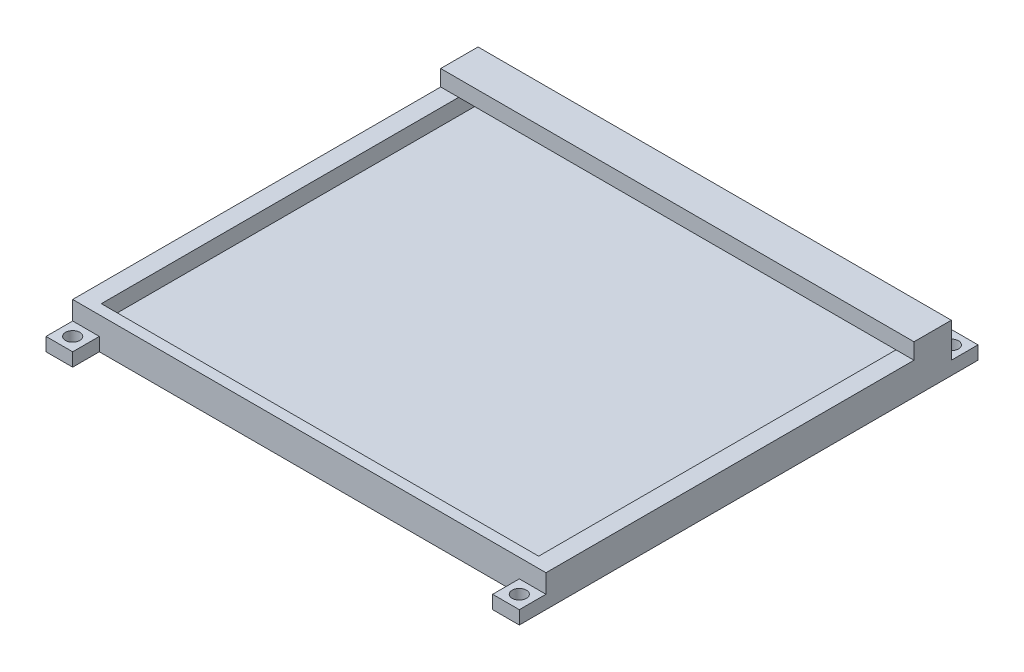
ISO-10303-21;
HEADER;
FILE_DESCRIPTION(('STEP AP214'),'2;1');
FILE_NAME('part.step','',(''),(''),'','','');
FILE_SCHEMA(('AUTOMOTIVE_DESIGN { 1 0 10303 214 1 1 1 1 }'));
ENDSEC;
DATA;
#1=APPLICATION_CONTEXT('core data for automotive mechanical design processes');
#2=APPLICATION_PROTOCOL_DEFINITION('international standard','automotive_design',2000,#1);
#3=PRODUCT_CONTEXT('',#1,'mechanical');
#4=PRODUCT('Part','Part','',(#3));
#5=PRODUCT_RELATED_PRODUCT_CATEGORY('part','',(#4));
#6=PRODUCT_DEFINITION_FORMATION('','',#4);
#7=PRODUCT_DEFINITION_CONTEXT('part definition',#1,'design');
#8=PRODUCT_DEFINITION('design','',#6,#7);
#9=PRODUCT_DEFINITION_SHAPE('','',#8);
#10=(LENGTH_UNIT() NAMED_UNIT(*) SI_UNIT(.MILLI.,.METRE.));
#11=(NAMED_UNIT(*) PLANE_ANGLE_UNIT() SI_UNIT($,.RADIAN.));
#12=(NAMED_UNIT(*) SI_UNIT($,.STERADIAN.) SOLID_ANGLE_UNIT());
#13=UNCERTAINTY_MEASURE_WITH_UNIT(LENGTH_MEASURE(1.E-05),#10,'distance_accuracy_value','');
#14=(GEOMETRIC_REPRESENTATION_CONTEXT(3) GLOBAL_UNCERTAINTY_ASSIGNED_CONTEXT((#13)) GLOBAL_UNIT_ASSIGNED_CONTEXT((#10,
#11,#12)) REPRESENTATION_CONTEXT('',''));
#15=CARTESIAN_POINT('',(0.,0.,0.));
#16=DIRECTION('',(0.,0.,1.));
#17=DIRECTION('',(1.,0.,0.));
#18=AXIS2_PLACEMENT_3D('',#15,#16,#17);
#19=CARTESIAN_POINT('',(0.,7.62,0.));
#20=DIRECTION('',(0.,-1.,0.));
#21=DIRECTION('',(0.,0.,-1.));
#22=AXIS2_PLACEMENT_3D('',#19,#20,#21);
#23=PLANE('',#22);
#24=DIRECTION('',(1.,0.,0.));
#25=VECTOR('',#24,1.);
#26=CARTESIAN_POINT('',(0.,7.62,-87.63));
#27=LINE('',#26,#25);
#28=CARTESIAN_POINT('',(0.,7.62,-87.63));
#29=VERTEX_POINT('',#28);
#30=CARTESIAN_POINT('',(4.279999949,7.62,-87.63));
#31=VERTEX_POINT('',#30);
#32=EDGE_CURVE('E49',#29,#31,#27,.T.);
#33=ORIENTED_EDGE('',*,*,#32,.F.);
#34=DIRECTION('',(0.,0.,1.));
#35=VECTOR('',#34,1.);
#36=CARTESIAN_POINT('',(0.,7.62,0.));
#37=LINE('',#36,#35);
#38=CARTESIAN_POINT('',(0.,7.62,0.));
#39=VERTEX_POINT('',#38);
#40=EDGE_CURVE('E216',#29,#39,#37,.T.);
#41=ORIENTED_EDGE('',*,*,#40,.T.);
#42=DIRECTION('',(1.,0.,0.));
#43=VECTOR('',#42,1.);
#44=CARTESIAN_POINT('',(0.,7.62,0.));
#45=LINE('',#44,#43);
#46=CARTESIAN_POINT('',(112.699999898,7.62,0.));
#47=VERTEX_POINT('',#46);
#48=EDGE_CURVE('E381',#39,#47,#45,.T.);
#49=ORIENTED_EDGE('',*,*,#48,.T.);
#50=DIRECTION('',(0.,0.,-1.));
#51=VECTOR('',#50,1.);
#52=CARTESIAN_POINT('',(112.699999898,7.62,0.));
#53=LINE('',#52,#51);
#54=CARTESIAN_POINT('',(112.699999898,7.62,-87.63));
#55=VERTEX_POINT('',#54);
#56=EDGE_CURVE('E384',#47,#55,#53,.T.);
#57=ORIENTED_EDGE('',*,*,#56,.T.);
#58=CARTESIAN_POINT('',(108.419999949,7.62,-87.63));
#59=VERTEX_POINT('',#58);
#60=EDGE_CURVE('E11',#59,#55,#27,.T.);
#61=ORIENTED_EDGE('',*,*,#60,.F.);
#62=DIRECTION('',(0.,0.,-1.));
#63=VECTOR('',#62,1.);
#64=CARTESIAN_POINT('',(108.419999949,7.62,-2.54000000000001));
#65=LINE('',#64,#63);
#66=CARTESIAN_POINT('',(108.419999949,7.62,-2.54000000000001));
#67=VERTEX_POINT('',#66);
#68=EDGE_CURVE('E366',#67,#59,#65,.T.);
#69=ORIENTED_EDGE('',*,*,#68,.F.);
#70=DIRECTION('',(1.,0.,0.));
#71=VECTOR('',#70,1.);
#72=CARTESIAN_POINT('',(4.279999949,7.62,-2.54000000000001));
#73=LINE('',#72,#71);
#74=CARTESIAN_POINT('',(4.279999949,7.62,-2.54000000000001));
#75=VERTEX_POINT('',#74);
#76=EDGE_CURVE('E362',#75,#67,#73,.T.);
#77=ORIENTED_EDGE('',*,*,#76,.F.);
#78=DIRECTION('',(0.,0.,1.));
#79=VECTOR('',#78,1.);
#80=CARTESIAN_POINT('',(4.279999949,7.62,-2.54000000000001));
#81=LINE('',#80,#79);
#82=EDGE_CURVE('E340',#31,#75,#81,.T.);
#83=ORIENTED_EDGE('',*,*,#82,.F.);
#84=EDGE_LOOP('',(#33,#41,#49,#57,#61,#69,#77,#83));
#85=FACE_BOUND('',#84,.T.);
#86=ADVANCED_FACE('F39',(#85),#23,.F.);
#87=CARTESIAN_POINT('',(0.,7.62,-96.52));
#88=DIRECTION('',(0.,0.,1.));
#89=DIRECTION('',(1.,0.,0.));
#90=AXIS2_PLACEMENT_3D('',#87,#88,#89);
#91=PLANE('',#90);
#92=DIRECTION('',(-1.,0.,0.));
#93=VECTOR('',#92,1.);
#94=CARTESIAN_POINT('',(112.699999898,3.175,-96.52));
#95=LINE('',#94,#93);
#96=CARTESIAN_POINT('',(112.699999898,3.175,-96.52));
#97=VERTEX_POINT('',#96);
#98=CARTESIAN_POINT('',(106.349999898,3.175,-96.52));
#99=VERTEX_POINT('',#98);
#100=EDGE_CURVE('E242',#97,#99,#95,.T.);
#101=ORIENTED_EDGE('',*,*,#100,.T.);
#102=DIRECTION('',(0.,-1.,0.));
#103=VECTOR('',#102,1.);
#104=CARTESIAN_POINT('',(106.349999898,3.175,-96.52));
#105=LINE('',#104,#103);
#106=CARTESIAN_POINT('',(106.349999898,0.,-96.52));
#107=VERTEX_POINT('',#106);
#108=EDGE_CURVE('E224',#99,#107,#105,.T.);
#109=ORIENTED_EDGE('',*,*,#108,.T.);
#110=DIRECTION('',(-1.,0.,0.));
#111=VECTOR('',#110,1.);
#112=CARTESIAN_POINT('',(0.,0.,-96.52));
#113=LINE('',#112,#111);
#114=CARTESIAN_POINT('',(6.35,0.,-96.52));
#115=VERTEX_POINT('',#114);
#116=EDGE_CURVE('E382',#107,#115,#113,.T.);
#117=ORIENTED_EDGE('',*,*,#116,.T.);
#118=DIRECTION('',(0.,-1.,0.));
#119=VECTOR('',#118,1.);
#120=CARTESIAN_POINT('',(6.35,3.175,-96.52));
#121=LINE('',#120,#119);
#122=CARTESIAN_POINT('',(6.35,3.175,-96.52));
#123=VERTEX_POINT('',#122);
#124=EDGE_CURVE('E249',#123,#115,#121,.T.);
#125=ORIENTED_EDGE('',*,*,#124,.F.);
#126=DIRECTION('',(-1.,0.,0.));
#127=VECTOR('',#126,1.);
#128=CARTESIAN_POINT('',(0.,3.175,-96.52));
#129=LINE('',#128,#127);
#130=CARTESIAN_POINT('',(0.,3.175,-96.52));
#131=VERTEX_POINT('',#130);
#132=EDGE_CURVE('E255',#123,#131,#129,.T.);
#133=ORIENTED_EDGE('',*,*,#132,.T.);
#134=DIRECTION('',(0.,-1.,0.));
#135=VECTOR('',#134,1.);
#136=CARTESIAN_POINT('',(0.,7.62,-96.52));
#137=LINE('',#136,#135);
#138=CARTESIAN_POINT('',(0.,11.43,-96.52));
#139=VERTEX_POINT('',#138);
#140=EDGE_CURVE('E386',#139,#131,#137,.T.);
#141=ORIENTED_EDGE('',*,*,#140,.F.);
#142=DIRECTION('',(-1.,0.,0.));
#143=VECTOR('',#142,1.);
#144=CARTESIAN_POINT('',(0.,11.43,-96.52));
#145=LINE('',#144,#143);
#146=CARTESIAN_POINT('',(112.699999898,11.43,-96.52));
#147=VERTEX_POINT('',#146);
#148=EDGE_CURVE('E211',#147,#139,#145,.T.);
#149=ORIENTED_EDGE('',*,*,#148,.F.);
#150=DIRECTION('',(0.,-1.,0.));
#151=VECTOR('',#150,1.);
#152=CARTESIAN_POINT('',(112.699999898,7.62,-96.52));
#153=LINE('',#152,#151);
#154=EDGE_CURVE('E394',#147,#97,#153,.T.);
#155=ORIENTED_EDGE('',*,*,#154,.T.);
#156=EDGE_LOOP('',(#101,#109,#117,#125,#133,#141,#149,#155));
#157=FACE_BOUND('',#156,.T.);
#158=ADVANCED_FACE('F440',(#157),#91,.F.);
#159=CARTESIAN_POINT('',(0.,7.62,0.));
#160=DIRECTION('',(0.,0.,-1.));
#161=DIRECTION('',(-1.,0.,0.));
#162=AXIS2_PLACEMENT_3D('',#159,#160,#161);
#163=PLANE('',#162);
#164=DIRECTION('',(1.,0.,0.));
#165=VECTOR('',#164,1.);
#166=CARTESIAN_POINT('',(0.,3.175,0.));
#167=LINE('',#166,#165);
#168=CARTESIAN_POINT('',(0.,3.175,0.));
#169=VERTEX_POINT('',#168);
#170=CARTESIAN_POINT('',(6.35,3.175,0.));
#171=VERTEX_POINT('',#170);
#172=EDGE_CURVE('E304',#169,#171,#167,.T.);
#173=ORIENTED_EDGE('',*,*,#172,.T.);
#174=DIRECTION('',(0.,-1.,0.));
#175=VECTOR('',#174,1.);
#176=CARTESIAN_POINT('',(6.35,3.175,0.));
#177=LINE('',#176,#175);
#178=CARTESIAN_POINT('',(6.35,0.,0.));
#179=VERTEX_POINT('',#178);
#180=EDGE_CURVE('E283',#171,#179,#177,.T.);
#181=ORIENTED_EDGE('',*,*,#180,.T.);
#182=DIRECTION('',(1.,0.,0.));
#183=VECTOR('',#182,1.);
#184=CARTESIAN_POINT('',(0.,0.,0.));
#185=LINE('',#184,#183);
#186=CARTESIAN_POINT('',(106.349999898,0.,0.));
#187=VERTEX_POINT('',#186);
#188=EDGE_CURVE('E388',#179,#187,#185,.T.);
#189=ORIENTED_EDGE('',*,*,#188,.T.);
#190=DIRECTION('',(0.,-1.,0.));
#191=VECTOR('',#190,1.);
#192=CARTESIAN_POINT('',(106.349999898,3.175,0.));
#193=LINE('',#192,#191);
#194=CARTESIAN_POINT('',(106.349999898,3.175,0.));
#195=VERTEX_POINT('',#194);
#196=EDGE_CURVE('E337',#195,#187,#193,.T.);
#197=ORIENTED_EDGE('',*,*,#196,.F.);
#198=DIRECTION('',(1.,0.,0.));
#199=VECTOR('',#198,1.);
#200=CARTESIAN_POINT('',(112.699999898,3.175,0.));
#201=LINE('',#200,#199);
#202=CARTESIAN_POINT('',(112.699999898,3.175,0.));
#203=VERTEX_POINT('',#202);
#204=EDGE_CURVE('E329',#195,#203,#201,.T.);
#205=ORIENTED_EDGE('',*,*,#204,.T.);
#206=DIRECTION('',(0.,-1.,0.));
#207=VECTOR('',#206,1.);
#208=CARTESIAN_POINT('',(112.699999898,7.62,0.));
#209=LINE('',#208,#207);
#210=EDGE_CURVE('E395',#47,#203,#209,.T.);
#211=ORIENTED_EDGE('',*,*,#210,.F.);
#212=ORIENTED_EDGE('',*,*,#48,.F.);
#213=DIRECTION('',(0.,-1.,0.));
#214=VECTOR('',#213,1.);
#215=CARTESIAN_POINT('',(0.,7.62,0.));
#216=LINE('',#215,#214);
#217=EDGE_CURVE('E43',#39,#169,#216,.T.);
#218=ORIENTED_EDGE('',*,*,#217,.T.);
#219=EDGE_LOOP('',(#173,#181,#189,#197,#205,#211,#212,#218));
#220=FACE_BOUND('',#219,.T.);
#221=ADVANCED_FACE('F403',(#220),#163,.F.);
#222=CARTESIAN_POINT('',(0.,7.62,0.));
#223=DIRECTION('',(1.,0.,0.));
#224=DIRECTION('',(0.,0.,-1.));
#225=AXIS2_PLACEMENT_3D('',#222,#223,#224);
#226=PLANE('',#225);
#227=DIRECTION('',(0.,0.,1.));
#228=VECTOR('',#227,1.);
#229=CARTESIAN_POINT('',(0.,0.,0.));
#230=LINE('',#229,#228);
#231=CARTESIAN_POINT('',(0.,0.,-102.87));
#232=VERTEX_POINT('',#231);
#233=CARTESIAN_POINT('',(0.,0.,6.35));
#234=VERTEX_POINT('',#233);
#235=EDGE_CURVE('E372',#232,#234,#230,.T.);
#236=ORIENTED_EDGE('',*,*,#235,.T.);
#237=DIRECTION('',(0.,-1.,0.));
#238=VECTOR('',#237,1.);
#239=CARTESIAN_POINT('',(0.,3.175,6.35));
#240=LINE('',#239,#238);
#241=CARTESIAN_POINT('',(0.,3.175,6.35));
#242=VERTEX_POINT('',#241);
#243=EDGE_CURVE('E280',#242,#234,#240,.T.);
#244=ORIENTED_EDGE('',*,*,#243,.F.);
#245=DIRECTION('',(0.,0.,-1.));
#246=VECTOR('',#245,1.);
#247=CARTESIAN_POINT('',(0.,3.175,0.));
#248=LINE('',#247,#246);
#249=EDGE_CURVE('E295',#242,#169,#248,.T.);
#250=ORIENTED_EDGE('',*,*,#249,.T.);
#251=ORIENTED_EDGE('',*,*,#217,.F.);
#252=ORIENTED_EDGE('',*,*,#40,.F.);
#253=DIRECTION('',(0.,-1.,0.));
#254=VECTOR('',#253,1.);
#255=CARTESIAN_POINT('',(0.,11.43,-87.63));
#256=LINE('',#255,#254);
#257=CARTESIAN_POINT('',(0.,11.43,-87.63));
#258=VERTEX_POINT('',#257);
#259=EDGE_CURVE('E198',#258,#29,#256,.T.);
#260=ORIENTED_EDGE('',*,*,#259,.F.);
#261=DIRECTION('',(0.,0.,1.));
#262=VECTOR('',#261,1.);
#263=CARTESIAN_POINT('',(0.,11.43,-96.52));
#264=LINE('',#263,#262);
#265=EDGE_CURVE('E205',#139,#258,#264,.T.);
#266=ORIENTED_EDGE('',*,*,#265,.F.);
#267=ORIENTED_EDGE('',*,*,#140,.T.);
#268=DIRECTION('',(0.,0.,-1.));
#269=VECTOR('',#268,1.);
#270=CARTESIAN_POINT('',(0.,3.175,-96.52));
#271=LINE('',#270,#269);
#272=CARTESIAN_POINT('',(0.,3.175,-102.87));
#273=VERTEX_POINT('',#272);
#274=EDGE_CURVE('E264',#131,#273,#271,.T.);
#275=ORIENTED_EDGE('',*,*,#274,.T.);
#276=DIRECTION('',(0.,-1.,0.));
#277=VECTOR('',#276,1.);
#278=CARTESIAN_POINT('',(0.,3.175,-102.87));
#279=LINE('',#278,#277);
#280=EDGE_CURVE('E252',#273,#232,#279,.T.);
#281=ORIENTED_EDGE('',*,*,#280,.T.);
#282=EDGE_LOOP('',(#236,#244,#250,#251,#252,#260,#266,#267,#275,#281));
#283=FACE_BOUND('',#282,.T.);
#284=ADVANCED_FACE('F41',(#283),#226,.F.);
#285=CARTESIAN_POINT('',(112.699999898,7.62,0.));
#286=DIRECTION('',(-1.,0.,0.));
#287=DIRECTION('',(0.,0.,1.));
#288=AXIS2_PLACEMENT_3D('',#285,#286,#287);
#289=PLANE('',#288);
#290=DIRECTION('',(0.,0.,-1.));
#291=VECTOR('',#290,1.);
#292=CARTESIAN_POINT('',(112.699999898,0.,0.));
#293=LINE('',#292,#291);
#294=CARTESIAN_POINT('',(112.699999898,0.,6.35));
#295=VERTEX_POINT('',#294);
#296=CARTESIAN_POINT('',(112.699999898,0.,-102.87));
#297=VERTEX_POINT('',#296);
#298=EDGE_CURVE('E390',#295,#297,#293,.T.);
#299=ORIENTED_EDGE('',*,*,#298,.T.);
#300=DIRECTION('',(0.,-1.,0.));
#301=VECTOR('',#300,1.);
#302=CARTESIAN_POINT('',(112.699999898,3.175,-102.87));
#303=LINE('',#302,#301);
#304=CARTESIAN_POINT('',(112.699999898,3.175,-102.87));
#305=VERTEX_POINT('',#304);
#306=EDGE_CURVE('E217',#305,#297,#303,.T.);
#307=ORIENTED_EDGE('',*,*,#306,.F.);
#308=DIRECTION('',(0.,0.,1.));
#309=VECTOR('',#308,1.);
#310=CARTESIAN_POINT('',(112.699999898,3.175,-96.52));
#311=LINE('',#310,#309);
#312=EDGE_CURVE('E233',#305,#97,#311,.T.);
#313=ORIENTED_EDGE('',*,*,#312,.T.);
#314=ORIENTED_EDGE('',*,*,#154,.F.);
#315=DIRECTION('',(0.,0.,-1.));
#316=VECTOR('',#315,1.);
#317=CARTESIAN_POINT('',(112.699999898,11.43,-96.52));
#318=LINE('',#317,#316);
#319=CARTESIAN_POINT('',(112.699999898,11.43,-87.63));
#320=VERTEX_POINT('',#319);
#321=EDGE_CURVE('E204',#320,#147,#318,.T.);
#322=ORIENTED_EDGE('',*,*,#321,.F.);
#323=DIRECTION('',(0.,-1.,0.));
#324=VECTOR('',#323,1.);
#325=CARTESIAN_POINT('',(112.699999898,11.43,-87.63));
#326=LINE('',#325,#324);
#327=EDGE_CURVE('E200',#320,#55,#326,.T.);
#328=ORIENTED_EDGE('',*,*,#327,.T.);
#329=ORIENTED_EDGE('',*,*,#56,.F.);
#330=ORIENTED_EDGE('',*,*,#210,.T.);
#331=DIRECTION('',(0.,0.,1.));
#332=VECTOR('',#331,1.);
#333=CARTESIAN_POINT('',(112.699999898,3.175,0.));
#334=LINE('',#333,#332);
#335=CARTESIAN_POINT('',(112.699999898,3.175,6.35));
#336=VERTEX_POINT('',#335);
#337=EDGE_CURVE('E320',#203,#336,#334,.T.);
#338=ORIENTED_EDGE('',*,*,#337,.T.);
#339=DIRECTION('',(0.,-1.,0.));
#340=VECTOR('',#339,1.);
#341=CARTESIAN_POINT('',(112.699999898,3.175,6.35));
#342=LINE('',#341,#340);
#343=EDGE_CURVE('E332',#336,#295,#342,.T.);
#344=ORIENTED_EDGE('',*,*,#343,.T.);
#345=EDGE_LOOP('',(#299,#307,#313,#314,#322,#328,#329,#330,#338,#344));
#346=FACE_BOUND('',#345,.T.);
#347=ADVANCED_FACE('F431',(#346),#289,.F.);
#348=CARTESIAN_POINT('',(0.,0.,0.));
#349=DIRECTION('',(0.,-1.,0.));
#350=DIRECTION('',(0.,0.,-1.));
#351=AXIS2_PLACEMENT_3D('',#348,#349,#350);
#352=PLANE('',#351);
#353=ORIENTED_EDGE('',*,*,#235,.F.);
#354=DIRECTION('',(1.,0.,0.));
#355=VECTOR('',#354,1.);
#356=CARTESIAN_POINT('',(0.,0.,-102.87));
#357=LINE('',#356,#355);
#358=CARTESIAN_POINT('',(6.35,0.,-102.87));
#359=VERTEX_POINT('',#358);
#360=EDGE_CURVE('E263',#232,#359,#357,.T.);
#361=ORIENTED_EDGE('',*,*,#360,.T.);
#362=DIRECTION('',(0.,0.,1.));
#363=VECTOR('',#362,1.);
#364=CARTESIAN_POINT('',(6.35,0.,-96.52));
#365=LINE('',#364,#363);
#366=EDGE_CURVE('E260',#359,#115,#365,.T.);
#367=ORIENTED_EDGE('',*,*,#366,.T.);
#368=ORIENTED_EDGE('',*,*,#116,.F.);
#369=DIRECTION('',(0.,0.,-1.));
#370=VECTOR('',#369,1.);
#371=CARTESIAN_POINT('',(106.349999898,0.,-96.52));
#372=LINE('',#371,#370);
#373=CARTESIAN_POINT('',(106.349999898,0.,-102.87));
#374=VERTEX_POINT('',#373);
#375=EDGE_CURVE('E232',#107,#374,#372,.T.);
#376=ORIENTED_EDGE('',*,*,#375,.T.);
#377=DIRECTION('',(1.,0.,0.));
#378=VECTOR('',#377,1.);
#379=CARTESIAN_POINT('',(112.699999898,0.,-102.87));
#380=LINE('',#379,#378);
#381=EDGE_CURVE('E229',#374,#297,#380,.T.);
#382=ORIENTED_EDGE('',*,*,#381,.T.);
#383=ORIENTED_EDGE('',*,*,#298,.F.);
#384=DIRECTION('',(-1.,0.,0.));
#385=VECTOR('',#384,1.);
#386=CARTESIAN_POINT('',(112.699999898,0.,6.35));
#387=LINE('',#386,#385);
#388=CARTESIAN_POINT('',(106.349999898,0.,6.35));
#389=VERTEX_POINT('',#388);
#390=EDGE_CURVE('E317',#295,#389,#387,.T.);
#391=ORIENTED_EDGE('',*,*,#390,.T.);
#392=DIRECTION('',(0.,0.,-1.));
#393=VECTOR('',#392,1.);
#394=CARTESIAN_POINT('',(106.349999898,0.,0.));
#395=LINE('',#394,#393);
#396=EDGE_CURVE('E324',#389,#187,#395,.T.);
#397=ORIENTED_EDGE('',*,*,#396,.T.);
#398=ORIENTED_EDGE('',*,*,#188,.F.);
#399=DIRECTION('',(0.,0.,1.));
#400=VECTOR('',#399,1.);
#401=CARTESIAN_POINT('',(6.35,0.,0.));
#402=LINE('',#401,#400);
#403=CARTESIAN_POINT('',(6.35,0.,6.35));
#404=VERTEX_POINT('',#403);
#405=EDGE_CURVE('E294',#179,#404,#402,.T.);
#406=ORIENTED_EDGE('',*,*,#405,.T.);
#407=DIRECTION('',(-1.,0.,0.));
#408=VECTOR('',#407,1.);
#409=CARTESIAN_POINT('',(0.,0.,6.35));
#410=LINE('',#409,#408);
#411=EDGE_CURVE('E291',#404,#234,#410,.T.);
#412=ORIENTED_EDGE('',*,*,#411,.T.);
#413=EDGE_LOOP('',(#353,#361,#367,#368,#376,#382,#383,#391,#397,#398,#406,#412));
#414=FACE_BOUND('',#413,.T.);
#415=CARTESIAN_POINT('',(109.524999898,0.,3.175));
#416=DIRECTION('',(0.,-1.,0.));
#417=DIRECTION('',(0.,0.,-1.));
#418=AXIS2_PLACEMENT_3D('',#415,#416,#417);
#419=CIRCLE('',#418,1.7);
#420=CARTESIAN_POINT('',(109.524999898,0.,1.475));
#421=VERTEX_POINT('',#420);
#422=EDGE_CURVE('E311',#421,#421,#419,.T.);
#423=ORIENTED_EDGE('',*,*,#422,.F.);
#424=EDGE_LOOP('',(#423));
#425=FACE_BOUND('',#424,.T.);
#426=CARTESIAN_POINT('',(3.175,0.,3.175));
#427=DIRECTION('',(0.,-1.,0.));
#428=DIRECTION('',(0.,0.,-1.));
#429=AXIS2_PLACEMENT_3D('',#426,#427,#428);
#430=CIRCLE('',#429,1.7);
#431=CARTESIAN_POINT('',(3.175,0.,1.475));
#432=VERTEX_POINT('',#431);
#433=EDGE_CURVE('E308',#432,#432,#430,.T.);
#434=ORIENTED_EDGE('',*,*,#433,.F.);
#435=EDGE_LOOP('',(#434));
#436=FACE_BOUND('',#435,.T.);
#437=CARTESIAN_POINT('',(3.175,0.,-99.695));
#438=DIRECTION('',(0.,-1.,0.));
#439=DIRECTION('',(0.,0.,-1.));
#440=AXIS2_PLACEMENT_3D('',#437,#438,#439);
#441=CIRCLE('',#440,1.7);
#442=CARTESIAN_POINT('',(3.175,0.,-101.395));
#443=VERTEX_POINT('',#442);
#444=EDGE_CURVE('E277',#443,#443,#441,.T.);
#445=ORIENTED_EDGE('',*,*,#444,.F.);
#446=EDGE_LOOP('',(#445));
#447=FACE_BOUND('',#446,.T.);
#448=CARTESIAN_POINT('',(109.524999898,0.,-99.695));
#449=DIRECTION('',(0.,-1.,0.));
#450=DIRECTION('',(0.,0.,-1.));
#451=AXIS2_PLACEMENT_3D('',#448,#449,#450);
#452=CIRCLE('',#451,1.7);
#453=CARTESIAN_POINT('',(109.524999898,0.,-101.395));
#454=VERTEX_POINT('',#453);
#455=EDGE_CURVE('E246',#454,#454,#452,.T.);
#456=ORIENTED_EDGE('',*,*,#455,.F.);
#457=EDGE_LOOP('',(#456));
#458=FACE_BOUND('',#457,.T.);
#459=ADVANCED_FACE('F414',(#414,#425,#436,#447,#458),#352,.T.);
#460=CARTESIAN_POINT('',(4.279999949,3.81,-2.54000000000001));
#461=DIRECTION('',(-1.,0.,0.));
#462=DIRECTION('',(0.,0.,1.));
#463=AXIS2_PLACEMENT_3D('',#460,#461,#462);
#464=PLANE('',#463);
#465=CARTESIAN_POINT('',(4.279999949,7.62,-93.98));
#466=VERTEX_POINT('',#465);
#467=EDGE_CURVE('E359',#466,#31,#81,.T.);
#468=ORIENTED_EDGE('',*,*,#467,.T.);
#469=ORIENTED_EDGE('',*,*,#82,.T.);
#470=DIRECTION('',(0.,1.,0.));
#471=VECTOR('',#470,1.);
#472=CARTESIAN_POINT('',(4.279999949,3.81,-2.54000000000001));
#473=LINE('',#472,#471);
#474=CARTESIAN_POINT('',(4.279999949,3.81,-2.54000000000001));
#475=VERTEX_POINT('',#474);
#476=EDGE_CURVE('E358',#475,#75,#473,.T.);
#477=ORIENTED_EDGE('',*,*,#476,.F.);
#478=DIRECTION('',(0.,0.,1.));
#479=VECTOR('',#478,1.);
#480=CARTESIAN_POINT('',(4.279999949,3.81,-2.54000000000001));
#481=LINE('',#480,#479);
#482=CARTESIAN_POINT('',(4.279999949,3.81,-93.98));
#483=VERTEX_POINT('',#482);
#484=EDGE_CURVE('E345',#483,#475,#481,.T.);
#485=ORIENTED_EDGE('',*,*,#484,.F.);
#486=DIRECTION('',(0.,1.,0.));
#487=VECTOR('',#486,1.);
#488=CARTESIAN_POINT('',(4.279999949,3.81,-93.98));
#489=LINE('',#488,#487);
#490=EDGE_CURVE('E370',#483,#466,#489,.T.);
#491=ORIENTED_EDGE('',*,*,#490,.T.);
#492=EDGE_LOOP('',(#468,#469,#477,#485,#491));
#493=FACE_BOUND('',#492,.T.);
#494=ADVANCED_FACE('F486',(#493),#464,.F.);
#495=CARTESIAN_POINT('',(4.279999949,3.81,-93.98));
#496=DIRECTION('',(0.,0.,-1.));
#497=DIRECTION('',(-1.,0.,0.));
#498=AXIS2_PLACEMENT_3D('',#495,#496,#497);
#499=PLANE('',#498);
#500=DIRECTION('',(-1.,0.,0.));
#501=VECTOR('',#500,1.);
#502=CARTESIAN_POINT('',(4.279999949,7.62,-93.98));
#503=LINE('',#502,#501);
#504=CARTESIAN_POINT('',(108.419999949,7.62,-93.98));
#505=VERTEX_POINT('',#504);
#506=EDGE_CURVE('E349',#505,#466,#503,.T.);
#507=ORIENTED_EDGE('',*,*,#506,.T.);
#508=ORIENTED_EDGE('',*,*,#490,.F.);
#509=DIRECTION('',(-1.,0.,0.));
#510=VECTOR('',#509,1.);
#511=CARTESIAN_POINT('',(4.279999949,3.81,-93.98));
#512=LINE('',#511,#510);
#513=CARTESIAN_POINT('',(108.419999949,3.81,-93.98));
#514=VERTEX_POINT('',#513);
#515=EDGE_CURVE('E355',#514,#483,#512,.T.);
#516=ORIENTED_EDGE('',*,*,#515,.F.);
#517=DIRECTION('',(0.,1.,0.));
#518=VECTOR('',#517,1.);
#519=CARTESIAN_POINT('',(108.419999949,3.81,-93.98));
#520=LINE('',#519,#518);
#521=EDGE_CURVE('E373',#514,#505,#520,.T.);
#522=ORIENTED_EDGE('',*,*,#521,.T.);
#523=EDGE_LOOP('',(#507,#508,#516,#522));
#524=FACE_BOUND('',#523,.T.);
#525=ADVANCED_FACE('F513',(#524),#499,.F.);
#526=CARTESIAN_POINT('',(108.419999949,3.81,-2.54000000000001));
#527=DIRECTION('',(1.,0.,0.));
#528=DIRECTION('',(0.,0.,-1.));
#529=AXIS2_PLACEMENT_3D('',#526,#527,#528);
#530=PLANE('',#529);
#531=ORIENTED_EDGE('',*,*,#68,.T.);
#532=EDGE_CURVE('E365',#59,#505,#65,.T.);
#533=ORIENTED_EDGE('',*,*,#532,.T.);
#534=ORIENTED_EDGE('',*,*,#521,.F.);
#535=DIRECTION('',(0.,0.,-1.));
#536=VECTOR('',#535,1.);
#537=CARTESIAN_POINT('',(108.419999949,3.81,-2.54000000000001));
#538=LINE('',#537,#536);
#539=CARTESIAN_POINT('',(108.419999949,3.81,-2.54000000000001));
#540=VERTEX_POINT('',#539);
#541=EDGE_CURVE('E352',#540,#514,#538,.T.);
#542=ORIENTED_EDGE('',*,*,#541,.F.);
#543=DIRECTION('',(0.,1.,0.));
#544=VECTOR('',#543,1.);
#545=CARTESIAN_POINT('',(108.419999949,3.81,-2.54000000000001));
#546=LINE('',#545,#544);
#547=EDGE_CURVE('E376',#540,#67,#546,.T.);
#548=ORIENTED_EDGE('',*,*,#547,.T.);
#549=EDGE_LOOP('',(#531,#533,#534,#542,#548));
#550=FACE_BOUND('',#549,.T.);
#551=ADVANCED_FACE('F520',(#550),#530,.F.);
#552=CARTESIAN_POINT('',(4.279999949,3.81,-2.54000000000001));
#553=DIRECTION('',(0.,0.,1.));
#554=DIRECTION('',(1.,0.,0.));
#555=AXIS2_PLACEMENT_3D('',#552,#553,#554);
#556=PLANE('',#555);
#557=ORIENTED_EDGE('',*,*,#76,.T.);
#558=ORIENTED_EDGE('',*,*,#547,.F.);
#559=DIRECTION('',(1.,0.,0.));
#560=VECTOR('',#559,1.);
#561=CARTESIAN_POINT('',(4.279999949,3.81,-2.54000000000001));
#562=LINE('',#561,#560);
#563=EDGE_CURVE('E348',#475,#540,#562,.T.);
#564=ORIENTED_EDGE('',*,*,#563,.F.);
#565=ORIENTED_EDGE('',*,*,#476,.T.);
#566=EDGE_LOOP('',(#557,#558,#564,#565));
#567=FACE_BOUND('',#566,.T.);
#568=ADVANCED_FACE('F528',(#567),#556,.F.);
#569=CARTESIAN_POINT('',(0.,3.81,0.));
#570=DIRECTION('',(0.,-1.,0.));
#571=DIRECTION('',(0.,0.,-1.));
#572=AXIS2_PLACEMENT_3D('',#569,#570,#571);
#573=PLANE('',#572);
#574=ORIENTED_EDGE('',*,*,#484,.T.);
#575=ORIENTED_EDGE('',*,*,#563,.T.);
#576=ORIENTED_EDGE('',*,*,#541,.T.);
#577=ORIENTED_EDGE('',*,*,#515,.T.);
#578=EDGE_LOOP('',(#574,#575,#576,#577));
#579=FACE_BOUND('',#578,.T.);
#580=ADVANCED_FACE('F537',(#579),#573,.F.);
#581=CARTESIAN_POINT('',(106.349999898,3.175,0.));
#582=DIRECTION('',(-1.,0.,0.));
#583=DIRECTION('',(0.,0.,1.));
#584=AXIS2_PLACEMENT_3D('',#581,#582,#583);
#585=PLANE('',#584);
#586=ORIENTED_EDGE('',*,*,#396,.F.);
#587=DIRECTION('',(0.,-1.,0.));
#588=VECTOR('',#587,1.);
#589=CARTESIAN_POINT('',(106.349999898,3.175,6.35));
#590=LINE('',#589,#588);
#591=CARTESIAN_POINT('',(106.349999898,3.175,6.35));
#592=VERTEX_POINT('',#591);
#593=EDGE_CURVE('E341',#592,#389,#590,.T.);
#594=ORIENTED_EDGE('',*,*,#593,.F.);
#595=DIRECTION('',(0.,0.,-1.));
#596=VECTOR('',#595,1.);
#597=CARTESIAN_POINT('',(106.349999898,3.175,0.));
#598=LINE('',#597,#596);
#599=EDGE_CURVE('E327',#592,#195,#598,.T.);
#600=ORIENTED_EDGE('',*,*,#599,.T.);
#601=ORIENTED_EDGE('',*,*,#196,.T.);
#602=EDGE_LOOP('',(#586,#594,#600,#601));
#603=FACE_BOUND('',#602,.T.);
#604=ADVANCED_FACE('F422',(#603),#585,.T.);
#605=CARTESIAN_POINT('',(112.699999898,3.175,6.35));
#606=DIRECTION('',(0.,0.,1.));
#607=DIRECTION('',(1.,0.,0.));
#608=AXIS2_PLACEMENT_3D('',#605,#606,#607);
#609=PLANE('',#608);
#610=ORIENTED_EDGE('',*,*,#390,.F.);
#611=ORIENTED_EDGE('',*,*,#343,.F.);
#612=DIRECTION('',(-1.,0.,0.));
#613=VECTOR('',#612,1.);
#614=CARTESIAN_POINT('',(112.699999898,3.175,6.35));
#615=LINE('',#614,#613);
#616=EDGE_CURVE('E323',#336,#592,#615,.T.);
#617=ORIENTED_EDGE('',*,*,#616,.T.);
#618=ORIENTED_EDGE('',*,*,#593,.T.);
#619=EDGE_LOOP('',(#610,#611,#617,#618));
#620=FACE_BOUND('',#619,.T.);
#621=ADVANCED_FACE('F427',(#620),#609,.T.);
#622=CARTESIAN_POINT('',(0.,3.175,0.));
#623=DIRECTION('',(0.,-1.,0.));
#624=DIRECTION('',(0.,0.,-1.));
#625=AXIS2_PLACEMENT_3D('',#622,#623,#624);
#626=PLANE('',#625);
#627=CARTESIAN_POINT('',(109.524999898,3.175,3.175));
#628=DIRECTION('',(0.,-1.,0.));
#629=DIRECTION('',(0.,0.,-1.));
#630=AXIS2_PLACEMENT_3D('',#627,#628,#629);
#631=CIRCLE('',#630,1.7);
#632=CARTESIAN_POINT('',(109.524999898,3.175,1.475));
#633=VERTEX_POINT('',#632);
#634=EDGE_CURVE('E314',#633,#633,#631,.T.);
#635=ORIENTED_EDGE('',*,*,#634,.T.);
#636=EDGE_LOOP('',(#635));
#637=FACE_BOUND('',#636,.T.);
#638=ORIENTED_EDGE('',*,*,#337,.F.);
#639=ORIENTED_EDGE('',*,*,#204,.F.);
#640=ORIENTED_EDGE('',*,*,#599,.F.);
#641=ORIENTED_EDGE('',*,*,#616,.F.);
#642=EDGE_LOOP('',(#638,#639,#640,#641));
#643=FACE_BOUND('',#642,.T.);
#644=ADVANCED_FACE('F430',(#637,#643),#626,.F.);
#645=CARTESIAN_POINT('',(109.524999898,3.175,3.175));
#646=DIRECTION('',(0.,-1.,0.));
#647=DIRECTION('',(0.,0.,-1.));
#648=AXIS2_PLACEMENT_3D('',#645,#646,#647);
#649=CYLINDRICAL_SURFACE('',#648,1.7);
#650=ORIENTED_EDGE('',*,*,#634,.F.);
#651=EDGE_LOOP('',(#650));
#652=FACE_BOUND('',#651,.T.);
#653=ORIENTED_EDGE('',*,*,#422,.T.);
#654=EDGE_LOOP('',(#653));
#655=FACE_BOUND('',#654,.T.);
#656=ADVANCED_FACE('F562',(#652,#655),#649,.F.);
#657=CARTESIAN_POINT('',(0.,3.175,6.35));
#658=DIRECTION('',(0.,0.,1.));
#659=DIRECTION('',(1.,0.,0.));
#660=AXIS2_PLACEMENT_3D('',#657,#658,#659);
#661=PLANE('',#660);
#662=ORIENTED_EDGE('',*,*,#411,.F.);
#663=DIRECTION('',(0.,-1.,0.));
#664=VECTOR('',#663,1.);
#665=CARTESIAN_POINT('',(6.35,3.175,6.35));
#666=LINE('',#665,#664);
#667=CARTESIAN_POINT('',(6.35,3.175,6.35));
#668=VERTEX_POINT('',#667);
#669=EDGE_CURVE('E287',#668,#404,#666,.T.);
#670=ORIENTED_EDGE('',*,*,#669,.F.);
#671=DIRECTION('',(-1.,0.,0.));
#672=VECTOR('',#671,1.);
#673=CARTESIAN_POINT('',(0.,3.175,6.35));
#674=LINE('',#673,#672);
#675=EDGE_CURVE('E286',#668,#242,#674,.T.);
#676=ORIENTED_EDGE('',*,*,#675,.T.);
#677=ORIENTED_EDGE('',*,*,#243,.T.);
#678=EDGE_LOOP('',(#662,#670,#676,#677));
#679=FACE_BOUND('',#678,.T.);
#680=ADVANCED_FACE('F412',(#679),#661,.T.);
#681=CARTESIAN_POINT('',(6.35,3.175,0.));
#682=DIRECTION('',(1.,0.,0.));
#683=DIRECTION('',(0.,0.,-1.));
#684=AXIS2_PLACEMENT_3D('',#681,#682,#683);
#685=PLANE('',#684);
#686=ORIENTED_EDGE('',*,*,#405,.F.);
#687=ORIENTED_EDGE('',*,*,#180,.F.);
#688=DIRECTION('',(0.,0.,1.));
#689=VECTOR('',#688,1.);
#690=CARTESIAN_POINT('',(6.35,3.175,0.));
#691=LINE('',#690,#689);
#692=EDGE_CURVE('E301',#171,#668,#691,.T.);
#693=ORIENTED_EDGE('',*,*,#692,.T.);
#694=ORIENTED_EDGE('',*,*,#669,.T.);
#695=EDGE_LOOP('',(#686,#687,#693,#694));
#696=FACE_BOUND('',#695,.T.);
#697=ADVANCED_FACE('F418',(#696),#685,.T.);
#698=CARTESIAN_POINT('',(0.,3.175,0.));
#699=DIRECTION('',(0.,1.,0.));
#700=DIRECTION('',(0.,0.,1.));
#701=AXIS2_PLACEMENT_3D('',#698,#699,#700);
#702=PLANE('',#701);
#703=CARTESIAN_POINT('',(3.175,3.175,3.175));
#704=DIRECTION('',(0.,-1.,0.));
#705=DIRECTION('',(0.,0.,-1.));
#706=AXIS2_PLACEMENT_3D('',#703,#704,#705);
#707=CIRCLE('',#706,1.7);
#708=CARTESIAN_POINT('',(3.175,3.175,1.475));
#709=VERTEX_POINT('',#708);
#710=EDGE_CURVE('E298',#709,#709,#707,.T.);
#711=ORIENTED_EDGE('',*,*,#710,.T.);
#712=EDGE_LOOP('',(#711));
#713=FACE_BOUND('',#712,.T.);
#714=ORIENTED_EDGE('',*,*,#249,.F.);
#715=ORIENTED_EDGE('',*,*,#675,.F.);
#716=ORIENTED_EDGE('',*,*,#692,.F.);
#717=ORIENTED_EDGE('',*,*,#172,.F.);
#718=EDGE_LOOP('',(#714,#715,#716,#717));
#719=FACE_BOUND('',#718,.T.);
#720=ADVANCED_FACE('F408',(#713,#719),#702,.T.);
#721=CARTESIAN_POINT('',(3.175,3.175,3.175));
#722=DIRECTION('',(0.,-1.,0.));
#723=DIRECTION('',(0.,0.,-1.));
#724=AXIS2_PLACEMENT_3D('',#721,#722,#723);
#725=CYLINDRICAL_SURFACE('',#724,1.7);
#726=ORIENTED_EDGE('',*,*,#710,.F.);
#727=EDGE_LOOP('',(#726));
#728=FACE_BOUND('',#727,.T.);
#729=ORIENTED_EDGE('',*,*,#433,.T.);
#730=EDGE_LOOP('',(#729));
#731=FACE_BOUND('',#730,.T.);
#732=ADVANCED_FACE('F589',(#728,#731),#725,.F.);
#733=CARTESIAN_POINT('',(6.35,3.175,-96.52));
#734=DIRECTION('',(1.,0.,0.));
#735=DIRECTION('',(0.,0.,-1.));
#736=AXIS2_PLACEMENT_3D('',#733,#734,#735);
#737=PLANE('',#736);
#738=ORIENTED_EDGE('',*,*,#366,.F.);
#739=DIRECTION('',(0.,-1.,0.));
#740=VECTOR('',#739,1.);
#741=CARTESIAN_POINT('',(6.35,3.175,-102.87));
#742=LINE('',#741,#740);
#743=CARTESIAN_POINT('',(6.35,3.175,-102.87));
#744=VERTEX_POINT('',#743);
#745=EDGE_CURVE('E256',#744,#359,#742,.T.);
#746=ORIENTED_EDGE('',*,*,#745,.F.);
#747=DIRECTION('',(0.,0.,1.));
#748=VECTOR('',#747,1.);
#749=CARTESIAN_POINT('',(6.35,3.175,-96.52));
#750=LINE('',#749,#748);
#751=EDGE_CURVE('E270',#744,#123,#750,.T.);
#752=ORIENTED_EDGE('',*,*,#751,.T.);
#753=ORIENTED_EDGE('',*,*,#124,.T.);
#754=EDGE_LOOP('',(#738,#746,#752,#753));
#755=FACE_BOUND('',#754,.T.);
#756=ADVANCED_FACE('F453',(#755),#737,.T.);
#757=CARTESIAN_POINT('',(0.,3.175,-102.87));
#758=DIRECTION('',(0.,0.,-1.));
#759=DIRECTION('',(-1.,0.,0.));
#760=AXIS2_PLACEMENT_3D('',#757,#758,#759);
#761=PLANE('',#760);
#762=ORIENTED_EDGE('',*,*,#360,.F.);
#763=ORIENTED_EDGE('',*,*,#280,.F.);
#764=DIRECTION('',(1.,0.,0.));
#765=VECTOR('',#764,1.);
#766=CARTESIAN_POINT('',(0.,3.175,-102.87));
#767=LINE('',#766,#765);
#768=EDGE_CURVE('E272',#273,#744,#767,.T.);
#769=ORIENTED_EDGE('',*,*,#768,.T.);
#770=ORIENTED_EDGE('',*,*,#745,.T.);
#771=EDGE_LOOP('',(#762,#763,#769,#770));
#772=FACE_BOUND('',#771,.T.);
#773=ADVANCED_FACE('F450',(#772),#761,.T.);
#774=CARTESIAN_POINT('',(0.,3.175,0.));
#775=DIRECTION('',(0.,-1.,0.));
#776=DIRECTION('',(0.,0.,-1.));
#777=AXIS2_PLACEMENT_3D('',#774,#775,#776);
#778=PLANE('',#777);
#779=CARTESIAN_POINT('',(3.175,3.175,-99.695));
#780=DIRECTION('',(0.,-1.,0.));
#781=DIRECTION('',(0.,0.,-1.));
#782=AXIS2_PLACEMENT_3D('',#779,#780,#781);
#783=CIRCLE('',#782,1.7);
#784=CARTESIAN_POINT('',(3.175,3.175,-101.395));
#785=VERTEX_POINT('',#784);
#786=EDGE_CURVE('E267',#785,#785,#783,.T.);
#787=ORIENTED_EDGE('',*,*,#786,.T.);
#788=EDGE_LOOP('',(#787));
#789=FACE_BOUND('',#788,.T.);
#790=ORIENTED_EDGE('',*,*,#274,.F.);
#791=ORIENTED_EDGE('',*,*,#132,.F.);
#792=ORIENTED_EDGE('',*,*,#751,.F.);
#793=ORIENTED_EDGE('',*,*,#768,.F.);
#794=EDGE_LOOP('',(#790,#791,#792,#793));
#795=FACE_BOUND('',#794,.T.);
#796=ADVANCED_FACE('F447',(#789,#795),#778,.F.);
#797=CARTESIAN_POINT('',(3.175,3.175,-99.695));
#798=DIRECTION('',(0.,-1.,0.));
#799=DIRECTION('',(0.,0.,-1.));
#800=AXIS2_PLACEMENT_3D('',#797,#798,#799);
#801=CYLINDRICAL_SURFACE('',#800,1.7);
#802=ORIENTED_EDGE('',*,*,#786,.F.);
#803=EDGE_LOOP('',(#802));
#804=FACE_BOUND('',#803,.T.);
#805=ORIENTED_EDGE('',*,*,#444,.T.);
#806=EDGE_LOOP('',(#805));
#807=FACE_BOUND('',#806,.T.);
#808=ADVANCED_FACE('F616',(#804,#807),#801,.F.);
#809=CARTESIAN_POINT('',(112.699999898,3.175,-102.87));
#810=DIRECTION('',(0.,0.,-1.));
#811=DIRECTION('',(-1.,0.,0.));
#812=AXIS2_PLACEMENT_3D('',#809,#810,#811);
#813=PLANE('',#812);
#814=ORIENTED_EDGE('',*,*,#381,.F.);
#815=DIRECTION('',(0.,-1.,0.));
#816=VECTOR('',#815,1.);
#817=CARTESIAN_POINT('',(106.349999898,3.175,-102.87));
#818=LINE('',#817,#816);
#819=CARTESIAN_POINT('',(106.349999898,3.175,-102.87));
#820=VERTEX_POINT('',#819);
#821=EDGE_CURVE('E220',#820,#374,#818,.T.);
#822=ORIENTED_EDGE('',*,*,#821,.F.);
#823=DIRECTION('',(1.,0.,0.));
#824=VECTOR('',#823,1.);
#825=CARTESIAN_POINT('',(112.699999898,3.175,-102.87));
#826=LINE('',#825,#824);
#827=EDGE_CURVE('E227',#820,#305,#826,.T.);
#828=ORIENTED_EDGE('',*,*,#827,.T.);
#829=ORIENTED_EDGE('',*,*,#306,.T.);
#830=EDGE_LOOP('',(#814,#822,#828,#829));
#831=FACE_BOUND('',#830,.T.);
#832=ADVANCED_FACE('F461',(#831),#813,.T.);
#833=CARTESIAN_POINT('',(106.349999898,3.175,-96.52));
#834=DIRECTION('',(-1.,0.,0.));
#835=DIRECTION('',(0.,0.,1.));
#836=AXIS2_PLACEMENT_3D('',#833,#834,#835);
#837=PLANE('',#836);
#838=ORIENTED_EDGE('',*,*,#375,.F.);
#839=ORIENTED_EDGE('',*,*,#108,.F.);
#840=DIRECTION('',(0.,0.,-1.));
#841=VECTOR('',#840,1.);
#842=CARTESIAN_POINT('',(106.349999898,3.175,-96.52));
#843=LINE('',#842,#841);
#844=EDGE_CURVE('E239',#99,#820,#843,.T.);
#845=ORIENTED_EDGE('',*,*,#844,.T.);
#846=ORIENTED_EDGE('',*,*,#821,.T.);
#847=EDGE_LOOP('',(#838,#839,#845,#846));
#848=FACE_BOUND('',#847,.T.);
#849=ADVANCED_FACE('F458',(#848),#837,.T.);
#850=CARTESIAN_POINT('',(0.,3.175,0.));
#851=DIRECTION('',(0.,1.,0.));
#852=DIRECTION('',(0.,0.,1.));
#853=AXIS2_PLACEMENT_3D('',#850,#851,#852);
#854=PLANE('',#853);
#855=CARTESIAN_POINT('',(109.524999898,3.175,-99.695));
#856=DIRECTION('',(0.,-1.,0.));
#857=DIRECTION('',(0.,0.,-1.));
#858=AXIS2_PLACEMENT_3D('',#855,#856,#857);
#859=CIRCLE('',#858,1.7);
#860=CARTESIAN_POINT('',(109.524999898,3.175,-101.395));
#861=VERTEX_POINT('',#860);
#862=EDGE_CURVE('E236',#861,#861,#859,.T.);
#863=ORIENTED_EDGE('',*,*,#862,.T.);
#864=EDGE_LOOP('',(#863));
#865=FACE_BOUND('',#864,.T.);
#866=ORIENTED_EDGE('',*,*,#312,.F.);
#867=ORIENTED_EDGE('',*,*,#827,.F.);
#868=ORIENTED_EDGE('',*,*,#844,.F.);
#869=ORIENTED_EDGE('',*,*,#100,.F.);
#870=EDGE_LOOP('',(#866,#867,#868,#869));
#871=FACE_BOUND('',#870,.T.);
#872=ADVANCED_FACE('F465',(#865,#871),#854,.T.);
#873=CARTESIAN_POINT('',(109.524999898,3.175,-99.695));
#874=DIRECTION('',(0.,-1.,0.));
#875=DIRECTION('',(0.,0.,-1.));
#876=AXIS2_PLACEMENT_3D('',#873,#874,#875);
#877=CYLINDRICAL_SURFACE('',#876,1.7);
#878=ORIENTED_EDGE('',*,*,#862,.F.);
#879=EDGE_LOOP('',(#878));
#880=FACE_BOUND('',#879,.T.);
#881=ORIENTED_EDGE('',*,*,#455,.T.);
#882=EDGE_LOOP('',(#881));
#883=FACE_BOUND('',#882,.T.);
#884=ADVANCED_FACE('F467',(#880,#883),#877,.F.);
#885=CARTESIAN_POINT('',(0.,11.43,-87.63));
#886=DIRECTION('',(0.,0.,-1.));
#887=DIRECTION('',(-1.,0.,0.));
#888=AXIS2_PLACEMENT_3D('',#885,#886,#887);
#889=PLANE('',#888);
#890=ORIENTED_EDGE('',*,*,#32,.T.);
#891=EDGE_CURVE('E50',#31,#59,#27,.T.);
#892=ORIENTED_EDGE('',*,*,#891,.T.);
#893=ORIENTED_EDGE('',*,*,#60,.T.);
#894=ORIENTED_EDGE('',*,*,#327,.F.);
#895=DIRECTION('',(1.,0.,0.));
#896=VECTOR('',#895,1.);
#897=CARTESIAN_POINT('',(0.,11.43,-87.63));
#898=LINE('',#897,#896);
#899=EDGE_CURVE('E194',#258,#320,#898,.T.);
#900=ORIENTED_EDGE('',*,*,#899,.F.);
#901=ORIENTED_EDGE('',*,*,#259,.T.);
#902=EDGE_LOOP('',(#890,#892,#893,#894,#900,#901));
#903=FACE_BOUND('',#902,.T.);
#904=ADVANCED_FACE('F196',(#903),#889,.F.);
#905=CARTESIAN_POINT('',(0.,11.43,0.));
#906=DIRECTION('',(0.,1.,0.));
#907=DIRECTION('',(0.,0.,1.));
#908=AXIS2_PLACEMENT_3D('',#905,#906,#907);
#909=PLANE('',#908);
#910=ORIENTED_EDGE('',*,*,#265,.T.);
#911=ORIENTED_EDGE('',*,*,#899,.T.);
#912=ORIENTED_EDGE('',*,*,#321,.T.);
#913=ORIENTED_EDGE('',*,*,#148,.T.);
#914=EDGE_LOOP('',(#910,#911,#912,#913));
#915=FACE_BOUND('',#914,.T.);
#916=ADVANCED_FACE('F209',(#915),#909,.T.);
#917=CARTESIAN_POINT('',(0.,7.62,0.));
#918=DIRECTION('',(0.,1.,0.));
#919=DIRECTION('',(0.,0.,1.));
#920=AXIS2_PLACEMENT_3D('',#917,#918,#919);
#921=PLANE('',#920);
#922=ORIENTED_EDGE('',*,*,#467,.F.);
#923=ORIENTED_EDGE('',*,*,#506,.F.);
#924=ORIENTED_EDGE('',*,*,#532,.F.);
#925=ORIENTED_EDGE('',*,*,#891,.F.);
#926=EDGE_LOOP('',(#922,#923,#924,#925));
#927=FACE_BOUND('',#926,.T.);
#928=ADVANCED_FACE('F695',(#927),#921,.F.);
#929=CLOSED_SHELL('',(#86,#158,#221,#284,#347,#459,#494,#525,#551,#568,#580,#604,#621,#644,#656,
#680,#697,#720,#732,#756,#773,#796,#808,#832,#849,#872,#884,#904,#916,#928));
#930=MANIFOLD_SOLID_BREP('B2',#929);
#931=ADVANCED_BREP_SHAPE_REPRESENTATION('',(#18,#930),#14);
#932=SHAPE_DEFINITION_REPRESENTATION(#9,#931);
ENDSEC;
END-ISO-10303-21;
